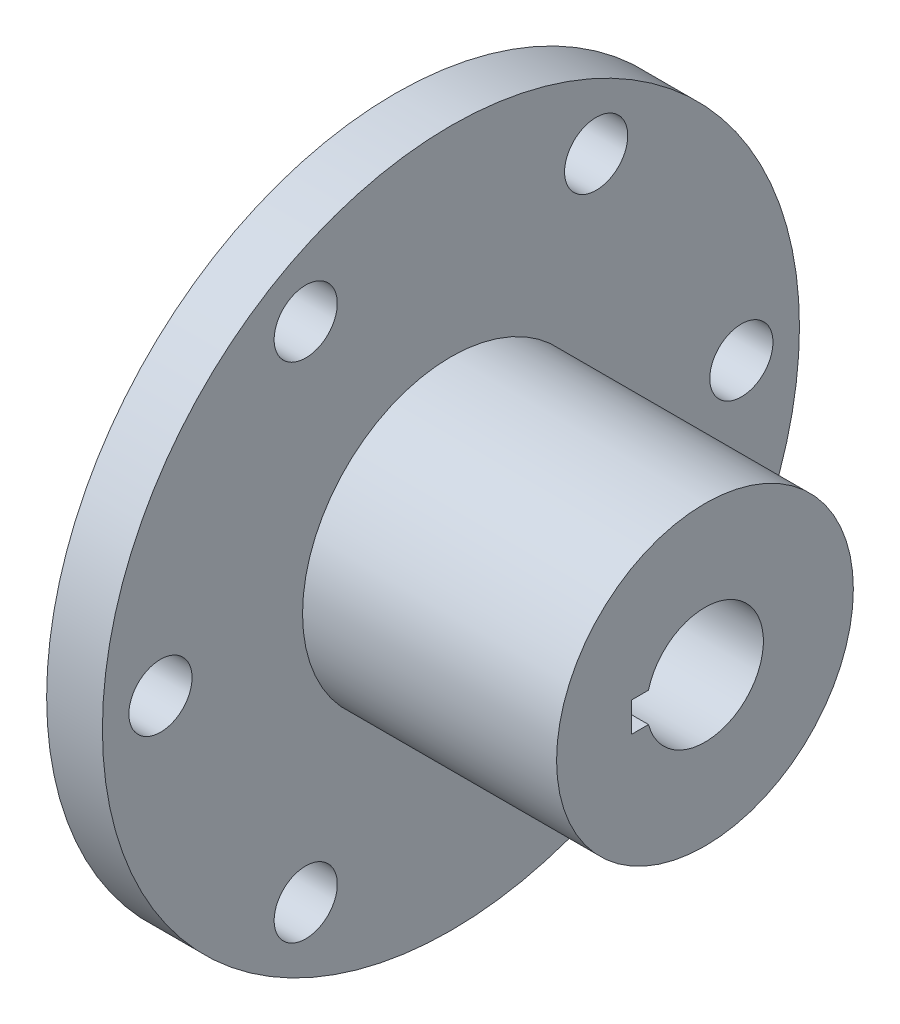
ISO-10303-21;
HEADER;
FILE_DESCRIPTION(('STEP AP214'),'2;1');
FILE_NAME('part.step','',(''),(''),'','','');
FILE_SCHEMA(('AUTOMOTIVE_DESIGN { 1 0 10303 214 1 1 1 1 }'));
ENDSEC;
DATA;
#1=APPLICATION_CONTEXT('core data for automotive mechanical design processes');
#2=APPLICATION_PROTOCOL_DEFINITION('international standard','automotive_design',2000,#1);
#3=PRODUCT_CONTEXT('',#1,'mechanical');
#4=PRODUCT('Part','Part','',(#3));
#5=PRODUCT_RELATED_PRODUCT_CATEGORY('part','',(#4));
#6=PRODUCT_DEFINITION_FORMATION('','',#4);
#7=PRODUCT_DEFINITION_CONTEXT('part definition',#1,'design');
#8=PRODUCT_DEFINITION('design','',#6,#7);
#9=PRODUCT_DEFINITION_SHAPE('','',#8);
#10=(LENGTH_UNIT() NAMED_UNIT(*) SI_UNIT(.MILLI.,.METRE.));
#11=(NAMED_UNIT(*) PLANE_ANGLE_UNIT() SI_UNIT($,.RADIAN.));
#12=(NAMED_UNIT(*) SI_UNIT($,.STERADIAN.) SOLID_ANGLE_UNIT());
#13=UNCERTAINTY_MEASURE_WITH_UNIT(LENGTH_MEASURE(1.E-05),#10,'distance_accuracy_value','');
#14=(GEOMETRIC_REPRESENTATION_CONTEXT(3) GLOBAL_UNCERTAINTY_ASSIGNED_CONTEXT((#13)) GLOBAL_UNIT_ASSIGNED_CONTEXT((#10,
#11,#12)) REPRESENTATION_CONTEXT('',''));
#15=CARTESIAN_POINT('',(0.,0.,0.));
#16=DIRECTION('',(0.,0.,1.));
#17=DIRECTION('',(1.,0.,0.));
#18=AXIS2_PLACEMENT_3D('',#15,#16,#17);
#19=CARTESIAN_POINT('',(-17.6070662460568,0.,0.));
#20=DIRECTION('',(1.,0.,0.));
#21=DIRECTION('',(0.,0.,-1.));
#22=AXIS2_PLACEMENT_3D('',#19,#20,#21);
#23=CYLINDRICAL_SURFACE('',#22,12.1666);
#24=CARTESIAN_POINT('',(7.79293375394323,0.,0.));
#25=DIRECTION('',(1.,0.,0.));
#26=DIRECTION('',(0.,0.,-1.));
#27=AXIS2_PLACEMENT_3D('',#24,#25,#26);
#28=CIRCLE('',#27,12.1666);
#29=CARTESIAN_POINT('',(7.79293375394323,0.,-12.1666));
#30=VERTEX_POINT('',#29);
#31=EDGE_CURVE('E71',#30,#30,#28,.F.);
#32=ORIENTED_EDGE('',*,*,#31,.T.);
#33=EDGE_LOOP('',(#32));
#34=FACE_BOUND('',#33,.T.);
#35=CARTESIAN_POINT('',(-13.0350662460568,0.,0.));
#36=DIRECTION('',(1.,0.,0.));
#37=DIRECTION('',(0.,0.,-1.));
#38=AXIS2_PLACEMENT_3D('',#35,#36,#37);
#39=CIRCLE('',#38,12.1666);
#40=CARTESIAN_POINT('',(-13.0350662460568,0.,-12.1666));
#41=VERTEX_POINT('',#40);
#42=EDGE_CURVE('E20',#41,#41,#39,.T.);
#43=ORIENTED_EDGE('',*,*,#42,.T.);
#44=EDGE_LOOP('',(#43));
#45=FACE_BOUND('',#44,.T.);
#46=ADVANCED_FACE('F17',(#34,#45),#23,.T.);
#47=CARTESIAN_POINT('',(-13.0350662460568,0.,12.1666));
#48=DIRECTION('',(-1.,0.,0.));
#49=DIRECTION('',(0.,0.,1.));
#50=AXIS2_PLACEMENT_3D('',#47,#48,#49);
#51=PLANE('',#50);
#52=ORIENTED_EDGE('',*,*,#42,.F.);
#53=EDGE_LOOP('',(#52));
#54=FACE_BOUND('',#53,.T.);
#55=CARTESIAN_POINT('',(-13.0350662460568,0.,0.));
#56=DIRECTION('',(1.,0.,0.));
#57=DIRECTION('',(0.,0.,-1.));
#58=AXIS2_PLACEMENT_3D('',#55,#56,#57);
#59=CIRCLE('',#58,28.575);
#60=CARTESIAN_POINT('',(-13.0350662460568,0.,-28.575));
#61=VERTEX_POINT('',#60);
#62=EDGE_CURVE('E75',#61,#61,#59,.F.);
#63=ORIENTED_EDGE('',*,*,#62,.F.);
#64=EDGE_LOOP('',(#63));
#65=FACE_BOUND('',#64,.T.);
#66=CARTESIAN_POINT('',(-13.0350662460568,0.,23.8125));
#67=DIRECTION('',(-1.,0.,0.));
#68=DIRECTION('',(0.,0.,1.));
#69=AXIS2_PLACEMENT_3D('',#66,#67,#68);
#70=CIRCLE('',#69,2.5908);
#71=CARTESIAN_POINT('',(-13.0350662460568,0.,26.4033));
#72=VERTEX_POINT('',#71);
#73=EDGE_CURVE('E116',#72,#72,#70,.T.);
#74=ORIENTED_EDGE('',*,*,#73,.T.);
#75=EDGE_LOOP('',(#74));
#76=FACE_BOUND('',#75,.T.);
#77=CARTESIAN_POINT('',(-13.0350662460568,20.6222299276169,11.90625));
#78=DIRECTION('',(-1.,0.,0.));
#79=DIRECTION('',(0.,0.,1.));
#80=AXIS2_PLACEMENT_3D('',#77,#78,#79);
#81=CIRCLE('',#80,2.5908);
#82=CARTESIAN_POINT('',(-13.0350662460568,20.6222299276169,14.49705));
#83=VERTEX_POINT('',#82);
#84=EDGE_CURVE('E119',#83,#83,#81,.T.);
#85=ORIENTED_EDGE('',*,*,#84,.T.);
#86=EDGE_LOOP('',(#85));
#87=FACE_BOUND('',#86,.T.);
#88=CARTESIAN_POINT('',(-13.0350662460568,20.6222299276169,-11.90625));
#89=DIRECTION('',(-1.,0.,0.));
#90=DIRECTION('',(0.,0.,1.));
#91=AXIS2_PLACEMENT_3D('',#88,#89,#90);
#92=CIRCLE('',#91,2.5908);
#93=CARTESIAN_POINT('',(-13.0350662460568,20.6222299276169,-9.31545));
#94=VERTEX_POINT('',#93);
#95=EDGE_CURVE('E122',#94,#94,#92,.T.);
#96=ORIENTED_EDGE('',*,*,#95,.T.);
#97=EDGE_LOOP('',(#96));
#98=FACE_BOUND('',#97,.T.);
#99=CARTESIAN_POINT('',(-13.0350662460568,0.,-23.8125));
#100=DIRECTION('',(-1.,0.,0.));
#101=DIRECTION('',(0.,0.,1.));
#102=AXIS2_PLACEMENT_3D('',#99,#100,#101);
#103=CIRCLE('',#102,2.5908);
#104=CARTESIAN_POINT('',(-13.0350662460568,0.,-21.2217));
#105=VERTEX_POINT('',#104);
#106=EDGE_CURVE('E125',#105,#105,#103,.T.);
#107=ORIENTED_EDGE('',*,*,#106,.T.);
#108=EDGE_LOOP('',(#107));
#109=FACE_BOUND('',#108,.T.);
#110=CARTESIAN_POINT('',(-13.0350662460568,-20.6222299276169,-11.90625));
#111=DIRECTION('',(-1.,0.,0.));
#112=DIRECTION('',(0.,0.,1.));
#113=AXIS2_PLACEMENT_3D('',#110,#111,#112);
#114=CIRCLE('',#113,2.5908);
#115=CARTESIAN_POINT('',(-13.0350662460568,-20.6222299276169,-9.31545));
#116=VERTEX_POINT('',#115);
#117=EDGE_CURVE('E128',#116,#116,#114,.T.);
#118=ORIENTED_EDGE('',*,*,#117,.T.);
#119=EDGE_LOOP('',(#118));
#120=FACE_BOUND('',#119,.T.);
#121=CARTESIAN_POINT('',(-13.0350662460568,-20.6222299276169,11.90625));
#122=DIRECTION('',(-1.,0.,0.));
#123=DIRECTION('',(0.,0.,1.));
#124=AXIS2_PLACEMENT_3D('',#121,#122,#123);
#125=CIRCLE('',#124,2.5908);
#126=CARTESIAN_POINT('',(-13.0350662460568,-20.6222299276169,14.49705));
#127=VERTEX_POINT('',#126);
#128=EDGE_CURVE('E131',#127,#127,#125,.T.);
#129=ORIENTED_EDGE('',*,*,#128,.T.);
#130=EDGE_LOOP('',(#129));
#131=FACE_BOUND('',#130,.T.);
#132=ADVANCED_FACE('F169',(#54,#65,#76,#87,#98,#109,#120,#131),#51,.F.);
#133=CARTESIAN_POINT('',(-76.926633053259,1.2192,6.0071));
#134=DIRECTION('',(0.,-1.,0.));
#135=DIRECTION('',(0.,0.,-1.));
#136=AXIS2_PLACEMENT_3D('',#133,#134,#135);
#137=PLANE('',#136);
#138=DIRECTION('',(-1.,0.,0.));
#139=VECTOR('',#138,1.);
#140=CARTESIAN_POINT('',(-76.926633053259,1.2192,6.0071));
#141=LINE('',#140,#139);
#142=CARTESIAN_POINT('',(-17.6070662460568,1.2192,6.0071));
#143=VERTEX_POINT('',#142);
#144=CARTESIAN_POINT('',(7.79293375394323,1.2192,6.0071));
#145=VERTEX_POINT('',#144);
#146=EDGE_CURVE('E73',#143,#145,#141,.F.);
#147=ORIENTED_EDGE('',*,*,#146,.F.);
#148=DIRECTION('',(0.,0.,-1.));
#149=VECTOR('',#148,1.);
#150=CARTESIAN_POINT('',(-17.6070662460568,1.2192,6.0071));
#151=LINE('',#150,#149);
#152=CARTESIAN_POINT('',(-17.6070662460568,1.2192,4.63006887313785));
#153=VERTEX_POINT('',#152);
#154=EDGE_CURVE('E63',#143,#153,#151,.T.);
#155=ORIENTED_EDGE('',*,*,#154,.T.);
#156=DIRECTION('',(-1.,0.,0.));
#157=VECTOR('',#156,1.);
#158=CARTESIAN_POINT('',(-76.926633053259,1.2192,4.63006887313785));
#159=LINE('',#158,#157);
#160=CARTESIAN_POINT('',(7.79293375394323,1.2192,4.63006887313785));
#161=VERTEX_POINT('',#160);
#162=EDGE_CURVE('E113',#153,#161,#159,.F.);
#163=ORIENTED_EDGE('',*,*,#162,.T.);
#164=DIRECTION('',(0.,0.,1.));
#165=VECTOR('',#164,1.);
#166=CARTESIAN_POINT('',(7.79293375394323,1.2192,0.));
#167=LINE('',#166,#165);
#168=EDGE_CURVE('E48',#161,#145,#167,.T.);
#169=ORIENTED_EDGE('',*,*,#168,.T.);
#170=EDGE_LOOP('',(#147,#155,#163,#169));
#171=FACE_BOUND('',#170,.T.);
#172=ADVANCED_FACE('F74',(#171),#137,.T.);
#173=CARTESIAN_POINT('',(7.79293375394323,0.,0.));
#174=DIRECTION('',(-1.,0.,0.));
#175=DIRECTION('',(0.,0.,1.));
#176=AXIS2_PLACEMENT_3D('',#173,#174,#175);
#177=PLANE('',#176);
#178=CARTESIAN_POINT('',(7.79293375394323,0.,0.));
#179=DIRECTION('',(-1.,0.,0.));
#180=DIRECTION('',(0.,0.,1.));
#181=AXIS2_PLACEMENT_3D('',#178,#179,#180);
#182=CIRCLE('',#181,4.7879);
#183=CARTESIAN_POINT('',(7.79293375394323,-1.2192,4.63006887313785));
#184=VERTEX_POINT('',#183);
#185=EDGE_CURVE('E111',#161,#184,#182,.T.);
#186=ORIENTED_EDGE('',*,*,#185,.T.);
#187=DIRECTION('',(0.,0.,1.));
#188=VECTOR('',#187,1.);
#189=CARTESIAN_POINT('',(7.79293375394323,-1.2192,0.));
#190=LINE('',#189,#188);
#191=CARTESIAN_POINT('',(7.79293375394323,-1.2192,6.0071));
#192=VERTEX_POINT('',#191);
#193=EDGE_CURVE('E133',#192,#184,#190,.F.);
#194=ORIENTED_EDGE('',*,*,#193,.F.);
#195=DIRECTION('',(0.,1.,0.));
#196=VECTOR('',#195,1.);
#197=CARTESIAN_POINT('',(7.79293375394323,-1.2192,6.0071));
#198=LINE('',#197,#196);
#199=EDGE_CURVE('E58',#145,#192,#198,.F.);
#200=ORIENTED_EDGE('',*,*,#199,.F.);
#201=ORIENTED_EDGE('',*,*,#168,.F.);
#202=EDGE_LOOP('',(#186,#194,#200,#201));
#203=FACE_BOUND('',#202,.T.);
#204=ORIENTED_EDGE('',*,*,#31,.F.);
#205=EDGE_LOOP('',(#204));
#206=FACE_BOUND('',#205,.T.);
#207=ADVANCED_FACE('F158',(#203,#206),#177,.F.);
#208=CARTESIAN_POINT('',(-76.926633053259,-1.2192,0.));
#209=DIRECTION('',(0.,1.,0.));
#210=DIRECTION('',(0.,0.,1.));
#211=AXIS2_PLACEMENT_3D('',#208,#209,#210);
#212=PLANE('',#211);
#213=DIRECTION('',(-1.,0.,0.));
#214=VECTOR('',#213,1.);
#215=CARTESIAN_POINT('',(-76.926633053259,-1.2192,6.0071));
#216=LINE('',#215,#214);
#217=CARTESIAN_POINT('',(-17.6070662460568,-1.2192,6.0071));
#218=VERTEX_POINT('',#217);
#219=EDGE_CURVE('E79',#192,#218,#216,.T.);
#220=ORIENTED_EDGE('',*,*,#219,.F.);
#221=ORIENTED_EDGE('',*,*,#193,.T.);
#222=DIRECTION('',(-1.,0.,0.));
#223=VECTOR('',#222,1.);
#224=CARTESIAN_POINT('',(-76.926633053259,-1.2192,4.63006887313785));
#225=LINE('',#224,#223);
#226=CARTESIAN_POINT('',(-17.6070662460568,-1.2192,4.63006887313785));
#227=VERTEX_POINT('',#226);
#228=EDGE_CURVE('E110',#184,#227,#225,.T.);
#229=ORIENTED_EDGE('',*,*,#228,.T.);
#230=DIRECTION('',(0.,0.,1.));
#231=VECTOR('',#230,1.);
#232=CARTESIAN_POINT('',(-17.6070662460568,-1.2192,0.));
#233=LINE('',#232,#231);
#234=EDGE_CURVE('E35',#227,#218,#233,.T.);
#235=ORIENTED_EDGE('',*,*,#234,.T.);
#236=EDGE_LOOP('',(#220,#221,#229,#235));
#237=FACE_BOUND('',#236,.T.);
#238=ADVANCED_FACE('F155',(#237),#212,.T.);
#239=CARTESIAN_POINT('',(-97.754633053259,-20.6222299276169,11.90625));
#240=DIRECTION('',(-1.,0.,0.));
#241=DIRECTION('',(0.,0.,1.));
#242=AXIS2_PLACEMENT_3D('',#239,#240,#241);
#243=CYLINDRICAL_SURFACE('',#242,2.5908);
#244=ORIENTED_EDGE('',*,*,#128,.F.);
#245=EDGE_LOOP('',(#244));
#246=FACE_BOUND('',#245,.T.);
#247=CARTESIAN_POINT('',(-17.6070662460568,-20.6222299276169,11.90625));
#248=DIRECTION('',(-1.,0.,0.));
#249=DIRECTION('',(0.,0.,1.));
#250=AXIS2_PLACEMENT_3D('',#247,#248,#249);
#251=CIRCLE('',#250,2.5908);
#252=CARTESIAN_POINT('',(-17.6070662460568,-20.6222299276169,14.49705));
#253=VERTEX_POINT('',#252);
#254=EDGE_CURVE('E107',#253,#253,#251,.T.);
#255=ORIENTED_EDGE('',*,*,#254,.T.);
#256=EDGE_LOOP('',(#255));
#257=FACE_BOUND('',#256,.T.);
#258=ADVANCED_FACE('F167',(#246,#257),#243,.F.);
#259=CARTESIAN_POINT('',(-97.754633053259,-20.6222299276169,-11.90625));
#260=DIRECTION('',(-1.,0.,0.));
#261=DIRECTION('',(0.,0.,1.));
#262=AXIS2_PLACEMENT_3D('',#259,#260,#261);
#263=CYLINDRICAL_SURFACE('',#262,2.5908);
#264=ORIENTED_EDGE('',*,*,#117,.F.);
#265=EDGE_LOOP('',(#264));
#266=FACE_BOUND('',#265,.T.);
#267=CARTESIAN_POINT('',(-17.6070662460568,-20.6222299276169,-11.90625));
#268=DIRECTION('',(-1.,0.,0.));
#269=DIRECTION('',(0.,0.,1.));
#270=AXIS2_PLACEMENT_3D('',#267,#268,#269);
#271=CIRCLE('',#270,2.5908);
#272=CARTESIAN_POINT('',(-17.6070662460568,-20.6222299276169,-9.31545));
#273=VERTEX_POINT('',#272);
#274=EDGE_CURVE('E104',#273,#273,#271,.T.);
#275=ORIENTED_EDGE('',*,*,#274,.T.);
#276=EDGE_LOOP('',(#275));
#277=FACE_BOUND('',#276,.T.);
#278=ADVANCED_FACE('F199',(#266,#277),#263,.F.);
#279=CARTESIAN_POINT('',(-97.754633053259,0.,-23.8125));
#280=DIRECTION('',(-1.,0.,0.));
#281=DIRECTION('',(0.,0.,1.));
#282=AXIS2_PLACEMENT_3D('',#279,#280,#281);
#283=CYLINDRICAL_SURFACE('',#282,2.5908);
#284=ORIENTED_EDGE('',*,*,#106,.F.);
#285=EDGE_LOOP('',(#284));
#286=FACE_BOUND('',#285,.T.);
#287=CARTESIAN_POINT('',(-17.6070662460568,0.,-23.8125));
#288=DIRECTION('',(-1.,0.,0.));
#289=DIRECTION('',(0.,0.,1.));
#290=AXIS2_PLACEMENT_3D('',#287,#288,#289);
#291=CIRCLE('',#290,2.5908);
#292=CARTESIAN_POINT('',(-17.6070662460568,0.,-21.2217));
#293=VERTEX_POINT('',#292);
#294=EDGE_CURVE('E101',#293,#293,#291,.T.);
#295=ORIENTED_EDGE('',*,*,#294,.T.);
#296=EDGE_LOOP('',(#295));
#297=FACE_BOUND('',#296,.T.);
#298=ADVANCED_FACE('F195',(#286,#297),#283,.F.);
#299=CARTESIAN_POINT('',(-97.754633053259,20.6222299276169,-11.90625));
#300=DIRECTION('',(-1.,0.,0.));
#301=DIRECTION('',(0.,0.,1.));
#302=AXIS2_PLACEMENT_3D('',#299,#300,#301);
#303=CYLINDRICAL_SURFACE('',#302,2.5908);
#304=ORIENTED_EDGE('',*,*,#95,.F.);
#305=EDGE_LOOP('',(#304));
#306=FACE_BOUND('',#305,.T.);
#307=CARTESIAN_POINT('',(-17.6070662460568,20.6222299276169,-11.90625));
#308=DIRECTION('',(-1.,0.,0.));
#309=DIRECTION('',(0.,0.,1.));
#310=AXIS2_PLACEMENT_3D('',#307,#308,#309);
#311=CIRCLE('',#310,2.5908);
#312=CARTESIAN_POINT('',(-17.6070662460568,20.6222299276169,-9.31545));
#313=VERTEX_POINT('',#312);
#314=EDGE_CURVE('E98',#313,#313,#311,.T.);
#315=ORIENTED_EDGE('',*,*,#314,.T.);
#316=EDGE_LOOP('',(#315));
#317=FACE_BOUND('',#316,.T.);
#318=ADVANCED_FACE('F191',(#306,#317),#303,.F.);
#319=CARTESIAN_POINT('',(-97.754633053259,20.6222299276169,11.90625));
#320=DIRECTION('',(-1.,0.,0.));
#321=DIRECTION('',(0.,0.,1.));
#322=AXIS2_PLACEMENT_3D('',#319,#320,#321);
#323=CYLINDRICAL_SURFACE('',#322,2.5908);
#324=ORIENTED_EDGE('',*,*,#84,.F.);
#325=EDGE_LOOP('',(#324));
#326=FACE_BOUND('',#325,.T.);
#327=CARTESIAN_POINT('',(-17.6070662460568,20.6222299276169,11.90625));
#328=DIRECTION('',(-1.,0.,0.));
#329=DIRECTION('',(0.,0.,1.));
#330=AXIS2_PLACEMENT_3D('',#327,#328,#329);
#331=CIRCLE('',#330,2.5908);
#332=CARTESIAN_POINT('',(-17.6070662460568,20.6222299276169,14.49705));
#333=VERTEX_POINT('',#332);
#334=EDGE_CURVE('E95',#333,#333,#331,.T.);
#335=ORIENTED_EDGE('',*,*,#334,.T.);
#336=EDGE_LOOP('',(#335));
#337=FACE_BOUND('',#336,.T.);
#338=ADVANCED_FACE('F187',(#326,#337),#323,.F.);
#339=CARTESIAN_POINT('',(-97.754633053259,0.,23.8125));
#340=DIRECTION('',(-1.,0.,0.));
#341=DIRECTION('',(0.,0.,1.));
#342=AXIS2_PLACEMENT_3D('',#339,#340,#341);
#343=CYLINDRICAL_SURFACE('',#342,2.5908);
#344=ORIENTED_EDGE('',*,*,#73,.F.);
#345=EDGE_LOOP('',(#344));
#346=FACE_BOUND('',#345,.T.);
#347=CARTESIAN_POINT('',(-17.6070662460568,0.,23.8125));
#348=DIRECTION('',(-1.,0.,0.));
#349=DIRECTION('',(0.,0.,1.));
#350=AXIS2_PLACEMENT_3D('',#347,#348,#349);
#351=CIRCLE('',#350,2.5908);
#352=CARTESIAN_POINT('',(-17.6070662460568,0.,26.4033));
#353=VERTEX_POINT('',#352);
#354=EDGE_CURVE('E83',#353,#353,#351,.T.);
#355=ORIENTED_EDGE('',*,*,#354,.T.);
#356=EDGE_LOOP('',(#355));
#357=FACE_BOUND('',#356,.T.);
#358=ADVANCED_FACE('F183',(#346,#357),#343,.F.);
#359=CARTESIAN_POINT('',(-17.6070662460568,0.,0.));
#360=DIRECTION('',(1.,0.,0.));
#361=DIRECTION('',(0.,0.,-1.));
#362=AXIS2_PLACEMENT_3D('',#359,#360,#361);
#363=CYLINDRICAL_SURFACE('',#362,28.575);
#364=ORIENTED_EDGE('',*,*,#62,.T.);
#365=EDGE_LOOP('',(#364));
#366=FACE_BOUND('',#365,.T.);
#367=CARTESIAN_POINT('',(-17.6070662460568,0.,0.));
#368=DIRECTION('',(1.,0.,0.));
#369=DIRECTION('',(0.,0.,-1.));
#370=AXIS2_PLACEMENT_3D('',#367,#368,#369);
#371=CIRCLE('',#370,28.575);
#372=CARTESIAN_POINT('',(-17.6070662460568,0.,-28.575));
#373=VERTEX_POINT('',#372);
#374=EDGE_CURVE('E80',#373,#373,#371,.T.);
#375=ORIENTED_EDGE('',*,*,#374,.T.);
#376=EDGE_LOOP('',(#375));
#377=FACE_BOUND('',#376,.T.);
#378=ADVANCED_FACE('F180',(#366,#377),#363,.T.);
#379=CARTESIAN_POINT('',(-76.926633053259,-1.2192,6.0071));
#380=DIRECTION('',(0.,0.,-1.));
#381=DIRECTION('',(-1.,0.,0.));
#382=AXIS2_PLACEMENT_3D('',#379,#380,#381);
#383=PLANE('',#382);
#384=ORIENTED_EDGE('',*,*,#199,.T.);
#385=ORIENTED_EDGE('',*,*,#219,.T.);
#386=DIRECTION('',(0.,1.,0.));
#387=VECTOR('',#386,1.);
#388=CARTESIAN_POINT('',(-17.6070662460568,0.,6.0071));
#389=LINE('',#388,#387);
#390=EDGE_CURVE('E26',#218,#143,#389,.T.);
#391=ORIENTED_EDGE('',*,*,#390,.T.);
#392=ORIENTED_EDGE('',*,*,#146,.T.);
#393=EDGE_LOOP('',(#384,#385,#391,#392));
#394=FACE_BOUND('',#393,.T.);
#395=ADVANCED_FACE('F77',(#394),#383,.T.);
#396=CARTESIAN_POINT('',(-76.926633053259,0.,0.));
#397=DIRECTION('',(-1.,0.,0.));
#398=DIRECTION('',(0.,0.,1.));
#399=AXIS2_PLACEMENT_3D('',#396,#397,#398);
#400=CYLINDRICAL_SURFACE('',#399,4.7879);
#401=ORIENTED_EDGE('',*,*,#185,.F.);
#402=ORIENTED_EDGE('',*,*,#162,.F.);
#403=CARTESIAN_POINT('',(-17.6070662460568,0.,0.));
#404=DIRECTION('',(-1.,0.,0.));
#405=DIRECTION('',(0.,0.,1.));
#406=AXIS2_PLACEMENT_3D('',#403,#404,#405);
#407=CIRCLE('',#406,4.7879);
#408=EDGE_CURVE('E11',#153,#227,#407,.T.);
#409=ORIENTED_EDGE('',*,*,#408,.T.);
#410=ORIENTED_EDGE('',*,*,#228,.F.);
#411=EDGE_LOOP('',(#401,#402,#409,#410));
#412=FACE_BOUND('',#411,.T.);
#413=ADVANCED_FACE('F157',(#412),#400,.F.);
#414=CARTESIAN_POINT('',(-17.6070662460568,0.,28.575));
#415=DIRECTION('',(1.,0.,0.));
#416=DIRECTION('',(0.,0.,-1.));
#417=AXIS2_PLACEMENT_3D('',#414,#415,#416);
#418=PLANE('',#417);
#419=ORIENTED_EDGE('',*,*,#408,.F.);
#420=ORIENTED_EDGE('',*,*,#154,.F.);
#421=ORIENTED_EDGE('',*,*,#390,.F.);
#422=ORIENTED_EDGE('',*,*,#234,.F.);
#423=EDGE_LOOP('',(#419,#420,#421,#422));
#424=FACE_BOUND('',#423,.T.);
#425=ORIENTED_EDGE('',*,*,#374,.F.);
#426=EDGE_LOOP('',(#425));
#427=FACE_BOUND('',#426,.T.);
#428=ORIENTED_EDGE('',*,*,#354,.F.);
#429=EDGE_LOOP('',(#428));
#430=FACE_BOUND('',#429,.T.);
#431=ORIENTED_EDGE('',*,*,#334,.F.);
#432=EDGE_LOOP('',(#431));
#433=FACE_BOUND('',#432,.T.);
#434=ORIENTED_EDGE('',*,*,#314,.F.);
#435=EDGE_LOOP('',(#434));
#436=FACE_BOUND('',#435,.T.);
#437=ORIENTED_EDGE('',*,*,#294,.F.);
#438=EDGE_LOOP('',(#437));
#439=FACE_BOUND('',#438,.T.);
#440=ORIENTED_EDGE('',*,*,#274,.F.);
#441=EDGE_LOOP('',(#440));
#442=FACE_BOUND('',#441,.T.);
#443=ORIENTED_EDGE('',*,*,#254,.F.);
#444=EDGE_LOOP('',(#443));
#445=FACE_BOUND('',#444,.T.);
#446=ADVANCED_FACE('F65',(#424,#427,#430,#433,#436,#439,#442,#445),#418,.F.);
#447=CLOSED_SHELL('',(#46,#132,#172,#207,#238,#258,#278,#298,#318,#338,#358,#378,#395,#413,#446));
#448=MANIFOLD_SOLID_BREP('B1',#447);
#449=ADVANCED_BREP_SHAPE_REPRESENTATION('',(#18,#448),#14);
#450=SHAPE_DEFINITION_REPRESENTATION(#9,#449);
ENDSEC;
END-ISO-10303-21;
